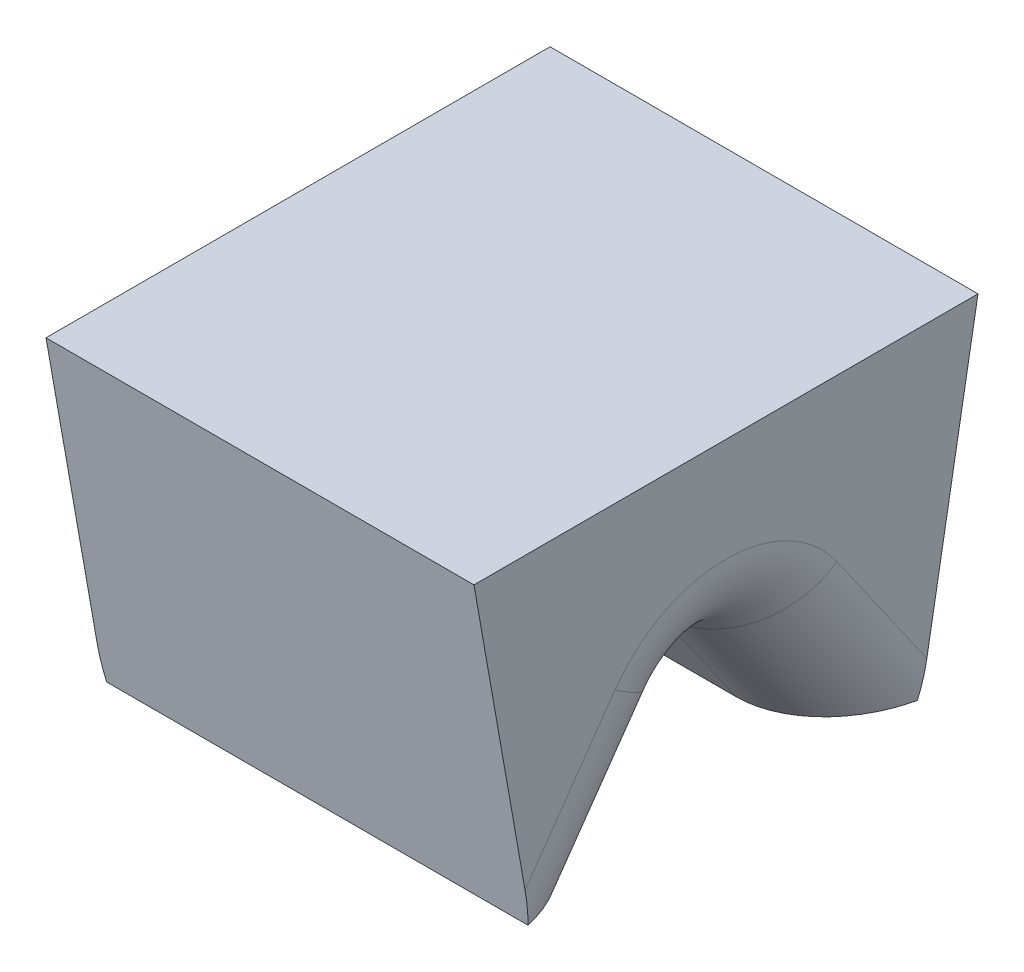
ISO-10303-21;
HEADER;
FILE_DESCRIPTION(('STEP AP214'),'2;1');
FILE_NAME('part.step','',(''),(''),'','','');
FILE_SCHEMA(('AUTOMOTIVE_DESIGN { 1 0 10303 214 1 1 1 1 }'));
ENDSEC;
DATA;
#1=APPLICATION_CONTEXT('core data for automotive mechanical design processes');
#2=APPLICATION_PROTOCOL_DEFINITION('international standard','automotive_design',2000,#1);
#3=PRODUCT_CONTEXT('',#1,'mechanical');
#4=PRODUCT('Part','Part','',(#3));
#5=PRODUCT_RELATED_PRODUCT_CATEGORY('part','',(#4));
#6=PRODUCT_DEFINITION_FORMATION('','',#4);
#7=PRODUCT_DEFINITION_CONTEXT('part definition',#1,'design');
#8=PRODUCT_DEFINITION('design','',#6,#7);
#9=PRODUCT_DEFINITION_SHAPE('','',#8);
#10=(LENGTH_UNIT() NAMED_UNIT(*) SI_UNIT(.MILLI.,.METRE.));
#11=(NAMED_UNIT(*) PLANE_ANGLE_UNIT() SI_UNIT($,.RADIAN.));
#12=(NAMED_UNIT(*) SI_UNIT($,.STERADIAN.) SOLID_ANGLE_UNIT());
#13=UNCERTAINTY_MEASURE_WITH_UNIT(LENGTH_MEASURE(1.E-05),#10,'distance_accuracy_value','');
#14=(GEOMETRIC_REPRESENTATION_CONTEXT(3) GLOBAL_UNCERTAINTY_ASSIGNED_CONTEXT((#13)) GLOBAL_UNIT_ASSIGNED_CONTEXT((#10,
#11,#12)) REPRESENTATION_CONTEXT('',''));
#15=CARTESIAN_POINT('',(0.,0.,0.));
#16=DIRECTION('',(0.,0.,1.));
#17=DIRECTION('',(1.,0.,0.));
#18=AXIS2_PLACEMENT_3D('',#15,#16,#17);
#19=CARTESIAN_POINT('',(0.,0.835526315789467,0.));
#20=DIRECTION('',(0.,1.,0.));
#21=DIRECTION('',(0.,0.,1.));
#22=AXIS2_PLACEMENT_3D('',#19,#20,#21);
#23=PLANE('',#22);
#24=DIRECTION('',(0.,0.,-1.));
#25=VECTOR('',#24,1.);
#26=CARTESIAN_POINT('',(-0.54102,0.835526315789467,1.50859998));
#27=LINE('',#26,#25);
#28=CARTESIAN_POINT('',(-0.54102,0.835526315789467,0.647705832565625));
#29=VERTEX_POINT('',#28);
#30=CARTESIAN_POINT('',(-0.54102,0.835526315789467,-0.647705832565625));
#31=VERTEX_POINT('',#30);
#32=EDGE_CURVE('E142',#29,#31,#27,.T.);
#33=ORIENTED_EDGE('',*,*,#32,.F.);
#34=DIRECTION('',(-1.,0.,0.));
#35=VECTOR('',#34,1.);
#36=CARTESIAN_POINT('',(1.50859998,0.835526315789467,0.647705832565625));
#37=LINE('',#36,#35);
#38=CARTESIAN_POINT('',(0.5588,0.835526315789467,0.647705832565625));
#39=VERTEX_POINT('',#38);
#40=EDGE_CURVE('E57',#39,#29,#37,.T.);
#41=ORIENTED_EDGE('',*,*,#40,.F.);
#42=DIRECTION('',(0.,0.,1.));
#43=VECTOR('',#42,1.);
#44=CARTESIAN_POINT('',(0.5588,0.835526315789467,1.50859998));
#45=LINE('',#44,#43);
#46=CARTESIAN_POINT('',(0.5588,0.835526315789467,-0.647705832565625));
#47=VERTEX_POINT('',#46);
#48=EDGE_CURVE('E12',#47,#39,#45,.T.);
#49=ORIENTED_EDGE('',*,*,#48,.F.);
#50=DIRECTION('',(1.,0.,0.));
#51=VECTOR('',#50,1.);
#52=CARTESIAN_POINT('',(1.50859998,0.835526315789467,-0.647705832565625));
#53=LINE('',#52,#51);
#54=EDGE_CURVE('E129',#31,#47,#53,.T.);
#55=ORIENTED_EDGE('',*,*,#54,.F.);
#56=EDGE_LOOP('',(#33,#41,#49,#55));
#57=FACE_BOUND('',#56,.T.);
#58=ADVANCED_FACE('F42',(#57),#23,.T.);
#59=CARTESIAN_POINT('',(1.50859998,0.,-0.50038));
#60=DIRECTION('',(0.,-0.173648177666931,-0.984807753012208));
#61=DIRECTION('',(0.,0.984807753012208,-0.173648177666931));
#62=AXIS2_PLACEMENT_3D('',#59,#60,#61);
#63=PLANE('',#62);
#64=DIRECTION('',(0.,0.984807753012208,-0.173648177666931));
#65=VECTOR('',#64,1.);
#66=CARTESIAN_POINT('',(-0.541020000000001,0.,-0.50038));
#67=LINE('',#66,#65);
#68=CARTESIAN_POINT('',(-0.541020000000001,0.0903067722746254,-0.516303520492712));
#69=VERTEX_POINT('',#68);
#70=EDGE_CURVE('E141',#69,#31,#67,.T.);
#71=ORIENTED_EDGE('',*,*,#70,.T.);
#72=ORIENTED_EDGE('',*,*,#54,.T.);
#73=DIRECTION('',(0.,-0.984807753012208,0.173648177666931));
#74=VECTOR('',#73,1.);
#75=CARTESIAN_POINT('',(0.5588,0.,-0.50038));
#76=LINE('',#75,#74);
#77=CARTESIAN_POINT('',(0.5588,0.0903067722746255,-0.516303520492712));
#78=VERTEX_POINT('',#77);
#79=EDGE_CURVE('E138',#47,#78,#76,.T.);
#80=ORIENTED_EDGE('',*,*,#79,.T.);
#81=CARTESIAN_POINT('',(0.30988,0.0903067722746255,-0.516303520492712));
#82=DIRECTION('',(0.,-0.173648177666931,-0.984807753012208));
#83=DIRECTION('',(0.,-0.984807753012208,0.173648177666931));
#84=AXIS2_PLACEMENT_3D('',#81,#82,#83);
#85=ELLIPSE('',#84,0.352026039945911,0.24892);
#86=CARTESIAN_POINT('',(0.550206300242459,0.,-0.50038));
#87=VERTEX_POINT('',#86);
#88=EDGE_CURVE('E251',#78,#87,#85,.T.);
#89=ORIENTED_EDGE('',*,*,#88,.T.);
#90=DIRECTION('',(-1.,0.,0.));
#91=VECTOR('',#90,1.);
#92=CARTESIAN_POINT('',(1.50859998,0.,-0.50038));
#93=LINE('',#92,#91);
#94=CARTESIAN_POINT('',(-0.532426300242459,0.,-0.50038));
#95=VERTEX_POINT('',#94);
#96=EDGE_CURVE('E157',#87,#95,#93,.T.);
#97=ORIENTED_EDGE('',*,*,#96,.T.);
#98=CARTESIAN_POINT('',(-0.2921,0.0903067722746255,-0.516303520492712));
#99=DIRECTION('',(0.,-0.173648177666931,-0.984807753012208));
#100=DIRECTION('',(0.,0.984807753012208,-0.173648177666931));
#101=AXIS2_PLACEMENT_3D('',#98,#99,#100);
#102=ELLIPSE('',#101,0.352026039945911,0.24892);
#103=EDGE_CURVE('E285',#95,#69,#102,.T.);
#104=ORIENTED_EDGE('',*,*,#103,.T.);
#105=EDGE_LOOP('',(#71,#72,#80,#89,#97,#104));
#106=FACE_BOUND('',#105,.T.);
#107=ADVANCED_FACE('F137',(#106),#63,.T.);
#108=CARTESIAN_POINT('',(1.50859998,0.,0.50038));
#109=DIRECTION('',(0.,-0.173648177666931,0.984807753012208));
#110=DIRECTION('',(0.,-0.984807753012208,-0.173648177666931));
#111=AXIS2_PLACEMENT_3D('',#108,#109,#110);
#112=PLANE('',#111);
#113=DIRECTION('',(0.,0.984807753012208,0.173648177666931));
#114=VECTOR('',#113,1.);
#115=CARTESIAN_POINT('',(0.5588,0.,0.50038));
#116=LINE('',#115,#114);
#117=CARTESIAN_POINT('',(0.5588,0.0903067722746255,0.516303520492712));
#118=VERTEX_POINT('',#117);
#119=EDGE_CURVE('E148',#118,#39,#116,.T.);
#120=ORIENTED_EDGE('',*,*,#119,.T.);
#121=ORIENTED_EDGE('',*,*,#40,.T.);
#122=DIRECTION('',(0.,-0.984807753012208,-0.173648177666931));
#123=VECTOR('',#122,1.);
#124=CARTESIAN_POINT('',(-0.541020000000001,0.,0.50038));
#125=LINE('',#124,#123);
#126=CARTESIAN_POINT('',(-0.541020000000001,0.0903067722746254,0.516303520492712));
#127=VERTEX_POINT('',#126);
#128=EDGE_CURVE('E160',#29,#127,#125,.T.);
#129=ORIENTED_EDGE('',*,*,#128,.T.);
#130=CARTESIAN_POINT('',(-0.2921,0.0903067722746255,0.516303520492712));
#131=DIRECTION('',(0.,-0.173648177666931,0.984807753012208));
#132=DIRECTION('',(0.,-0.984807753012208,-0.173648177666931));
#133=AXIS2_PLACEMENT_3D('',#130,#131,#132);
#134=ELLIPSE('',#133,0.352026039945911,0.24892);
#135=CARTESIAN_POINT('',(-0.532426300242459,0.,0.50038));
#136=VERTEX_POINT('',#135);
#137=EDGE_CURVE('E64',#127,#136,#134,.T.);
#138=ORIENTED_EDGE('',*,*,#137,.T.);
#139=DIRECTION('',(-1.,0.,0.));
#140=VECTOR('',#139,1.);
#141=CARTESIAN_POINT('',(1.50859998,0.,0.50038));
#142=LINE('',#141,#140);
#143=CARTESIAN_POINT('',(0.550206300242459,0.,0.50038));
#144=VERTEX_POINT('',#143);
#145=EDGE_CURVE('E150',#144,#136,#142,.T.);
#146=ORIENTED_EDGE('',*,*,#145,.F.);
#147=CARTESIAN_POINT('',(0.30988,0.0903067722746255,0.516303520492712));
#148=DIRECTION('',(0.,-0.173648177666931,0.984807753012208));
#149=DIRECTION('',(0.,0.984807753012208,0.173648177666931));
#150=AXIS2_PLACEMENT_3D('',#147,#148,#149);
#151=ELLIPSE('',#150,0.352026039945911,0.24892);
#152=EDGE_CURVE('E267',#144,#118,#151,.T.);
#153=ORIENTED_EDGE('',*,*,#152,.T.);
#154=EDGE_LOOP('',(#120,#121,#129,#138,#146,#153));
#155=FACE_BOUND('',#154,.T.);
#156=ADVANCED_FACE('F215',(#155),#112,.T.);
#157=CARTESIAN_POINT('',(-0.541020000000001,1.48860002,1.50859998));
#158=DIRECTION('',(-1.,0.,0.));
#159=DIRECTION('',(0.,-1.,0.));
#160=AXIS2_PLACEMENT_3D('',#157,#158,#159);
#161=PLANE('',#160);
#162=ORIENTED_EDGE('',*,*,#128,.F.);
#163=ORIENTED_EDGE('',*,*,#32,.T.);
#164=ORIENTED_EDGE('',*,*,#70,.F.);
#165=DIRECTION('',(0.,-0.819152044288993,-0.573576436351044));
#166=VECTOR('',#165,1.);
#167=CARTESIAN_POINT('',(-0.54102,0.420573128321436,-0.285048528371684));
#168=LINE('',#167,#166);
#169=CARTESIAN_POINT('',(-0.54102,0.420573128321436,-0.285048528371684));
#170=VERTEX_POINT('',#169);
#171=EDGE_CURVE('E294',#69,#170,#168,.F.);
#172=ORIENTED_EDGE('',*,*,#171,.T.);
#173=CARTESIAN_POINT('',(-0.54102,0.22098,0.));
#174=DIRECTION('',(-1.,0.,0.));
#175=DIRECTION('',(0.,-1.,0.));
#176=AXIS2_PLACEMENT_3D('',#173,#174,#175);
#177=CIRCLE('',#176,0.34798);
#178=CARTESIAN_POINT('',(-0.54102,0.420573128321436,0.285048528371684));
#179=VERTEX_POINT('',#178);
#180=EDGE_CURVE('E292',#170,#179,#177,.F.);
#181=ORIENTED_EDGE('',*,*,#180,.T.);
#182=DIRECTION('',(0.,0.819152044288993,-0.573576436351044));
#183=VECTOR('',#182,1.);
#184=CARTESIAN_POINT('',(-0.54102,0.142774646536502,0.479565119420707));
#185=LINE('',#184,#183);
#186=EDGE_CURVE('E289',#179,#127,#185,.F.);
#187=ORIENTED_EDGE('',*,*,#186,.T.);
#188=EDGE_LOOP('',(#162,#163,#164,#172,#181,#187));
#189=FACE_BOUND('',#188,.T.);
#190=ADVANCED_FACE('F320',(#189),#161,.T.);
#191=CARTESIAN_POINT('',(0.5588,-0.00999998,1.50859998));
#192=DIRECTION('',(1.,0.,0.));
#193=DIRECTION('',(0.,1.,0.));
#194=AXIS2_PLACEMENT_3D('',#191,#192,#193);
#195=PLANE('',#194);
#196=ORIENTED_EDGE('',*,*,#79,.F.);
#197=ORIENTED_EDGE('',*,*,#48,.T.);
#198=ORIENTED_EDGE('',*,*,#119,.F.);
#199=DIRECTION('',(0.,-0.819152044288993,0.573576436351044));
#200=VECTOR('',#199,1.);
#201=CARTESIAN_POINT('',(0.5588,0.420573128321436,0.285048528371684));
#202=LINE('',#201,#200);
#203=CARTESIAN_POINT('',(0.5588,0.420573128321436,0.285048528371684));
#204=VERTEX_POINT('',#203);
#205=EDGE_CURVE('E244',#118,#204,#202,.F.);
#206=ORIENTED_EDGE('',*,*,#205,.T.);
#207=CARTESIAN_POINT('',(0.5588,0.22098,0.));
#208=DIRECTION('',(1.,0.,0.));
#209=DIRECTION('',(0.,1.,0.));
#210=AXIS2_PLACEMENT_3D('',#207,#208,#209);
#211=CIRCLE('',#210,0.34798);
#212=CARTESIAN_POINT('',(0.5588,0.420573128321436,-0.285048528371684));
#213=VERTEX_POINT('',#212);
#214=EDGE_CURVE('E248',#204,#213,#211,.F.);
#215=ORIENTED_EDGE('',*,*,#214,.T.);
#216=DIRECTION('',(0.,0.819152044288993,0.573576436351044));
#217=VECTOR('',#216,1.);
#218=CARTESIAN_POINT('',(0.5588,0.142774646536502,-0.479565119420707));
#219=LINE('',#218,#217);
#220=EDGE_CURVE('E146',#213,#78,#219,.F.);
#221=ORIENTED_EDGE('',*,*,#220,.T.);
#222=EDGE_LOOP('',(#196,#197,#198,#206,#215,#221));
#223=FACE_BOUND('',#222,.T.);
#224=ADVANCED_FACE('F144',(#223),#195,.T.);
#225=CARTESIAN_POINT('',(0.,0.,0.));
#226=DIRECTION('',(0.,1.,0.));
#227=DIRECTION('',(0.,0.,1.));
#228=AXIS2_PLACEMENT_3D('',#225,#226,#227);
#229=PLANE('',#228);
#230=CARTESIAN_POINT('',(0.30988,0.,-0.275661792556291));
#231=DIRECTION('',(-1.,0.,0.));
#232=VECTOR('',#231,1.);
#233=LINE('',#230,#232);
#234=CARTESIAN_POINT('',(0.30988,0.,-0.275661792556291));
#235=VERTEX_POINT('',#234);
#236=CARTESIAN_POINT('',(-0.2921,0.,-0.275661792556291));
#237=VERTEX_POINT('',#236);
#238=EDGE_CURVE('E240',#235,#237,#233,.T.);
#239=ORIENTED_EDGE('',*,*,#238,.T.);
#240=CARTESIAN_POINT('',(-0.2921,0.,-0.579537003190792));
#241=DIRECTION('',(0.,1.,0.));
#242=DIRECTION('',(0.,0.,1.));
#243=AXIS2_PLACEMENT_3D('',#240,#241,#242);
#244=ELLIPSE('',#243,0.303875210634501,0.24892);
#245=EDGE_CURVE('E281',#237,#95,#244,.F.);
#246=ORIENTED_EDGE('',*,*,#245,.T.);
#247=ORIENTED_EDGE('',*,*,#96,.F.);
#248=CARTESIAN_POINT('',(0.30988,0.,-0.579537003190792));
#249=DIRECTION('',(0.,1.,0.));
#250=DIRECTION('',(0.,0.,-1.));
#251=AXIS2_PLACEMENT_3D('',#248,#249,#250);
#252=ELLIPSE('',#251,0.303875210634501,0.24892);
#253=EDGE_CURVE('E253',#87,#235,#252,.F.);
#254=ORIENTED_EDGE('',*,*,#253,.T.);
#255=EDGE_LOOP('',(#239,#246,#247,#254));
#256=FACE_BOUND('',#255,.T.);
#257=ADVANCED_FACE('F182',(#256),#229,.F.);
#258=ORIENTED_EDGE('',*,*,#145,.T.);
#259=CARTESIAN_POINT('',(-0.2921,0.,0.579537003190792));
#260=DIRECTION('',(0.,1.,0.));
#261=DIRECTION('',(0.,0.,1.));
#262=AXIS2_PLACEMENT_3D('',#259,#260,#261);
#263=ELLIPSE('',#262,0.303875210634501,0.24892);
#264=CARTESIAN_POINT('',(-0.2921,0.,0.275661792556291));
#265=VERTEX_POINT('',#264);
#266=EDGE_CURVE('E50',#136,#265,#263,.F.);
#267=ORIENTED_EDGE('',*,*,#266,.T.);
#268=CARTESIAN_POINT('',(-0.2921,0.,0.275661792556291));
#269=DIRECTION('',(1.,0.,0.));
#270=VECTOR('',#269,1.);
#271=LINE('',#268,#270);
#272=CARTESIAN_POINT('',(0.30988,0.,0.275661792556291));
#273=VERTEX_POINT('',#272);
#274=EDGE_CURVE('E162',#265,#273,#271,.T.);
#275=ORIENTED_EDGE('',*,*,#274,.T.);
#276=CARTESIAN_POINT('',(0.30988,0.,0.579537003190792));
#277=DIRECTION('',(0.,1.,0.));
#278=DIRECTION('',(0.,0.,-1.));
#279=AXIS2_PLACEMENT_3D('',#276,#277,#278);
#280=ELLIPSE('',#279,0.303875210634501,0.24892);
#281=EDGE_CURVE('E263',#273,#144,#280,.F.);
#282=ORIENTED_EDGE('',*,*,#281,.T.);
#283=EDGE_LOOP('',(#258,#267,#275,#282));
#284=FACE_BOUND('',#283,.T.);
#285=ADVANCED_FACE('F171',(#284),#229,.F.);
#286=CARTESIAN_POINT('',(-1.20142,0.277798481784934,-0.0811452015072678));
#287=DIRECTION('',(0.,0.573576436351044,-0.819152044288993));
#288=DIRECTION('',(0.,0.819152044288993,0.573576436351044));
#289=AXIS2_PLACEMENT_3D('',#286,#287,#288);
#290=PLANE('',#289);
#291=DIRECTION('',(1.,0.,0.));
#292=VECTOR('',#291,1.);
#293=CARTESIAN_POINT('',(-1.20142,0.277798481784934,-0.0811452015072678));
#294=LINE('',#293,#292);
#295=CARTESIAN_POINT('',(-0.2921,0.277798481784934,-0.0811452015072678));
#296=VERTEX_POINT('',#295);
#297=CARTESIAN_POINT('',(0.30988,0.277798481784934,-0.0811452015072678));
#298=VERTEX_POINT('',#297);
#299=EDGE_CURVE('E279',#296,#298,#294,.T.);
#300=ORIENTED_EDGE('',*,*,#299,.F.);
#301=DIRECTION('',(0.,-0.819152044288993,-0.573576436351044));
#302=VECTOR('',#301,1.);
#303=CARTESIAN_POINT('',(-0.2921,0.,-0.27566179255629));
#304=LINE('',#303,#302);
#305=EDGE_CURVE('E271',#296,#237,#304,.T.);
#306=ORIENTED_EDGE('',*,*,#305,.T.);
#307=ORIENTED_EDGE('',*,*,#238,.F.);
#308=DIRECTION('',(0.,0.819152044288993,0.573576436351044));
#309=VECTOR('',#308,1.);
#310=CARTESIAN_POINT('',(0.30988,0.277798481784935,-0.0811452015072677));
#311=LINE('',#310,#309);
#312=EDGE_CURVE('E242',#235,#298,#311,.T.);
#313=ORIENTED_EDGE('',*,*,#312,.T.);
#314=EDGE_LOOP('',(#300,#306,#307,#313));
#315=FACE_BOUND('',#314,.T.);
#316=ADVANCED_FACE('F181',(#315),#290,.F.);
#317=CARTESIAN_POINT('',(-1.20142,-0.00999998000000014,0.282663853934237));
#318=DIRECTION('',(0.,0.573576436351044,0.819152044288993));
#319=DIRECTION('',(0.,-0.819152044288993,0.573576436351044));
#320=AXIS2_PLACEMENT_3D('',#317,#318,#319);
#321=PLANE('',#320);
#322=ORIENTED_EDGE('',*,*,#274,.F.);
#323=DIRECTION('',(0.,0.819152044288993,-0.573576436351044));
#324=VECTOR('',#323,1.);
#325=CARTESIAN_POINT('',(-0.2921,0.277798481784934,0.0811452015072678));
#326=LINE('',#325,#324);
#327=CARTESIAN_POINT('',(-0.2921,0.277798481784934,0.0811452015072678));
#328=VERTEX_POINT('',#327);
#329=EDGE_CURVE('E297',#265,#328,#326,.T.);
#330=ORIENTED_EDGE('',*,*,#329,.T.);
#331=DIRECTION('',(1.,0.,0.));
#332=VECTOR('',#331,1.);
#333=CARTESIAN_POINT('',(-1.20142,0.277798481784934,0.0811452015072678));
#334=LINE('',#333,#332);
#335=CARTESIAN_POINT('',(0.30988,0.277798481784934,0.0811452015072678));
#336=VERTEX_POINT('',#335);
#337=EDGE_CURVE('E152',#328,#336,#334,.T.);
#338=ORIENTED_EDGE('',*,*,#337,.T.);
#339=DIRECTION('',(0.,-0.819152044288993,0.573576436351044));
#340=VECTOR('',#339,1.);
#341=CARTESIAN_POINT('',(0.30988,0.,0.275661792556291));
#342=LINE('',#341,#340);
#343=EDGE_CURVE('E260',#336,#273,#342,.T.);
#344=ORIENTED_EDGE('',*,*,#343,.T.);
#345=EDGE_LOOP('',(#322,#330,#338,#344));
#346=FACE_BOUND('',#345,.T.);
#347=ADVANCED_FACE('F220',(#346),#321,.F.);
#348=CARTESIAN_POINT('',(-1.20142,0.22098,0.));
#349=DIRECTION('',(1.,0.,0.));
#350=DIRECTION('',(0.,0.,-1.));
#351=AXIS2_PLACEMENT_3D('',#348,#349,#350);
#352=CYLINDRICAL_SURFACE('',#351,0.0990600000000002);
#353=ORIENTED_EDGE('',*,*,#337,.F.);
#354=CARTESIAN_POINT('',(-0.2921,0.22098,0.));
#355=DIRECTION('',(-1.,0.,0.));
#356=DIRECTION('',(0.,-1.,0.));
#357=AXIS2_PLACEMENT_3D('',#354,#355,#356);
#358=CIRCLE('',#357,0.0990600000000002);
#359=EDGE_CURVE('E296',#328,#296,#358,.T.);
#360=ORIENTED_EDGE('',*,*,#359,.T.);
#361=ORIENTED_EDGE('',*,*,#299,.T.);
#362=CARTESIAN_POINT('',(0.30988,0.22098,0.));
#363=DIRECTION('',(1.,0.,0.));
#364=DIRECTION('',(0.,1.,0.));
#365=AXIS2_PLACEMENT_3D('',#362,#363,#364);
#366=CIRCLE('',#365,0.0990600000000002);
#367=EDGE_CURVE('E255',#298,#336,#366,.T.);
#368=ORIENTED_EDGE('',*,*,#367,.T.);
#369=EDGE_LOOP('',(#353,#360,#361,#368));
#370=FACE_BOUND('',#369,.T.);
#371=ADVANCED_FACE('F197',(#370),#352,.F.);
#372=CARTESIAN_POINT('',(0.30988,0.132774666536502,0.486567180798653));
#373=DIRECTION('',(0.,0.819152044288993,-0.573576436351044));
#374=DIRECTION('',(0.,0.573576436351044,0.819152044288993));
#375=AXIS2_PLACEMENT_3D('',#372,#373,#374);
#376=CYLINDRICAL_SURFACE('',#375,0.24892);
#377=ORIENTED_EDGE('',*,*,#281,.F.);
#378=ORIENTED_EDGE('',*,*,#343,.F.);
#379=CARTESIAN_POINT('',(0.30988,0.420573128321436,0.285048528371684));
#380=DIRECTION('',(0.,0.819152044288993,-0.573576436351044));
#381=DIRECTION('',(0.,0.573576436351044,0.819152044288993));
#382=AXIS2_PLACEMENT_3D('',#379,#380,#381);
#383=CIRCLE('',#382,0.24892);
#384=EDGE_CURVE('E275',#204,#336,#383,.T.);
#385=ORIENTED_EDGE('',*,*,#384,.F.);
#386=ORIENTED_EDGE('',*,*,#205,.F.);
#387=ORIENTED_EDGE('',*,*,#152,.F.);
#388=EDGE_LOOP('',(#377,#378,#385,#386,#387));
#389=FACE_BOUND('',#388,.T.);
#390=ADVANCED_FACE('F193',(#389),#376,.T.);
#391=CARTESIAN_POINT('',(0.30988,0.22098,0.));
#392=DIRECTION('',(1.,0.,0.));
#393=DIRECTION('',(0.,1.,0.));
#394=AXIS2_PLACEMENT_3D('',#391,#392,#393);
#395=TOROIDAL_SURFACE('',#394,0.34798,0.24892);
#396=ORIENTED_EDGE('',*,*,#384,.T.);
#397=ORIENTED_EDGE('',*,*,#367,.F.);
#398=CARTESIAN_POINT('',(0.30988,0.420573128321436,-0.285048528371684));
#399=DIRECTION('',(0.,-0.819152044288993,-0.573576436351044));
#400=DIRECTION('',(0.,0.573576436351044,-0.819152044288993));
#401=AXIS2_PLACEMENT_3D('',#398,#399,#400);
#402=CIRCLE('',#401,0.24892);
#403=EDGE_CURVE('E272',#213,#298,#402,.T.);
#404=ORIENTED_EDGE('',*,*,#403,.F.);
#405=ORIENTED_EDGE('',*,*,#214,.F.);
#406=EDGE_LOOP('',(#396,#397,#404,#405));
#407=FACE_BOUND('',#406,.T.);
#408=ADVANCED_FACE('F189',(#407),#395,.T.);
#409=CARTESIAN_POINT('',(0.30988,0.420573128321436,-0.285048528371684));
#410=DIRECTION('',(0.,-0.819152044288993,-0.573576436351044));
#411=DIRECTION('',(0.,0.573576436351044,-0.819152044288993));
#412=AXIS2_PLACEMENT_3D('',#409,#410,#411);
#413=CYLINDRICAL_SURFACE('',#412,0.24892);
#414=ORIENTED_EDGE('',*,*,#88,.F.);
#415=ORIENTED_EDGE('',*,*,#220,.F.);
#416=ORIENTED_EDGE('',*,*,#403,.T.);
#417=ORIENTED_EDGE('',*,*,#312,.F.);
#418=ORIENTED_EDGE('',*,*,#253,.F.);
#419=EDGE_LOOP('',(#414,#415,#416,#417,#418));
#420=FACE_BOUND('',#419,.T.);
#421=ADVANCED_FACE('F185',(#420),#413,.T.);
#422=CARTESIAN_POINT('',(-0.2921,0.132774666536502,0.486567180798653));
#423=DIRECTION('',(0.,-0.819152044288993,0.573576436351044));
#424=DIRECTION('',(0.,-0.573576436351044,-0.819152044288993));
#425=AXIS2_PLACEMENT_3D('',#422,#423,#424);
#426=CYLINDRICAL_SURFACE('',#425,0.24892);
#427=ORIENTED_EDGE('',*,*,#137,.F.);
#428=ORIENTED_EDGE('',*,*,#186,.F.);
#429=CARTESIAN_POINT('',(-0.2921,0.420573128321436,0.285048528371684));
#430=DIRECTION('',(0.,0.819152044288993,-0.573576436351044));
#431=DIRECTION('',(0.,0.573576436351044,0.819152044288993));
#432=AXIS2_PLACEMENT_3D('',#429,#430,#431);
#433=CIRCLE('',#432,0.24892);
#434=EDGE_CURVE('E276',#328,#179,#433,.T.);
#435=ORIENTED_EDGE('',*,*,#434,.F.);
#436=ORIENTED_EDGE('',*,*,#329,.F.);
#437=ORIENTED_EDGE('',*,*,#266,.F.);
#438=EDGE_LOOP('',(#427,#428,#435,#436,#437));
#439=FACE_BOUND('',#438,.T.);
#440=ADVANCED_FACE('F44',(#439),#426,.T.);
#441=CARTESIAN_POINT('',(-0.2921,0.22098,0.));
#442=DIRECTION('',(-1.,0.,0.));
#443=DIRECTION('',(0.,-1.,0.));
#444=AXIS2_PLACEMENT_3D('',#441,#442,#443);
#445=TOROIDAL_SURFACE('',#444,0.34798,0.24892);
#446=ORIENTED_EDGE('',*,*,#434,.T.);
#447=ORIENTED_EDGE('',*,*,#180,.F.);
#448=CARTESIAN_POINT('',(-0.2921,0.420573128321436,-0.285048528371684));
#449=DIRECTION('',(0.,-0.819152044288993,-0.573576436351044));
#450=DIRECTION('',(0.,0.573576436351044,-0.819152044288993));
#451=AXIS2_PLACEMENT_3D('',#448,#449,#450);
#452=CIRCLE('',#451,0.24892);
#453=EDGE_CURVE('E310',#296,#170,#452,.T.);
#454=ORIENTED_EDGE('',*,*,#453,.F.);
#455=ORIENTED_EDGE('',*,*,#359,.F.);
#456=EDGE_LOOP('',(#446,#447,#454,#455));
#457=FACE_BOUND('',#456,.T.);
#458=ADVANCED_FACE('F201',(#457),#445,.T.);
#459=CARTESIAN_POINT('',(-0.2921,0.420573128321436,-0.285048528371684));
#460=DIRECTION('',(0.,0.819152044288993,0.573576436351044));
#461=DIRECTION('',(0.,-0.573576436351044,0.819152044288993));
#462=AXIS2_PLACEMENT_3D('',#459,#460,#461);
#463=CYLINDRICAL_SURFACE('',#462,0.24892);
#464=ORIENTED_EDGE('',*,*,#453,.T.);
#465=ORIENTED_EDGE('',*,*,#171,.F.);
#466=ORIENTED_EDGE('',*,*,#103,.F.);
#467=ORIENTED_EDGE('',*,*,#245,.F.);
#468=ORIENTED_EDGE('',*,*,#305,.F.);
#469=EDGE_LOOP('',(#464,#465,#466,#467,#468));
#470=FACE_BOUND('',#469,.T.);
#471=ADVANCED_FACE('F199',(#470),#463,.T.);
#472=CLOSED_SHELL('',(#58,#107,#156,#190,#224,#257,#285,#316,#347,#371,#390,#408,#421,#440,#458,#471));
#473=MANIFOLD_SOLID_BREP('B2',#472);
#474=ADVANCED_BREP_SHAPE_REPRESENTATION('',(#18,#473),#14);
#475=SHAPE_DEFINITION_REPRESENTATION(#9,#474);
ENDSEC;
END-ISO-10303-21;
